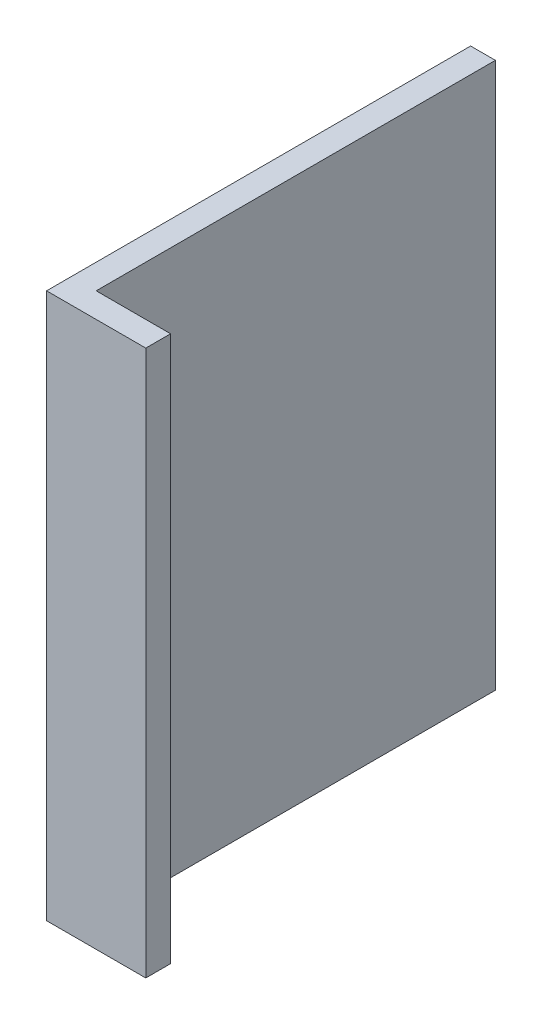
ISO-10303-21;
HEADER;
FILE_DESCRIPTION(('STEP AP214'),'2;1');
FILE_NAME('part.step','',(''),(''),'','','');
FILE_SCHEMA(('AUTOMOTIVE_DESIGN { 1 0 10303 214 1 1 1 1 }'));
ENDSEC;
DATA;
#1=APPLICATION_CONTEXT('core data for automotive mechanical design processes');
#2=APPLICATION_PROTOCOL_DEFINITION('international standard','automotive_design',2000,#1);
#3=PRODUCT_CONTEXT('',#1,'mechanical');
#4=PRODUCT('Part','Part','',(#3));
#5=PRODUCT_RELATED_PRODUCT_CATEGORY('part','',(#4));
#6=PRODUCT_DEFINITION_FORMATION('','',#4);
#7=PRODUCT_DEFINITION_CONTEXT('part definition',#1,'design');
#8=PRODUCT_DEFINITION('design','',#6,#7);
#9=PRODUCT_DEFINITION_SHAPE('','',#8);
#10=(LENGTH_UNIT() NAMED_UNIT(*) SI_UNIT(.MILLI.,.METRE.));
#11=(NAMED_UNIT(*) PLANE_ANGLE_UNIT() SI_UNIT($,.RADIAN.));
#12=(NAMED_UNIT(*) SI_UNIT($,.STERADIAN.) SOLID_ANGLE_UNIT());
#13=UNCERTAINTY_MEASURE_WITH_UNIT(LENGTH_MEASURE(1.E-05),#10,'distance_accuracy_value','');
#14=(GEOMETRIC_REPRESENTATION_CONTEXT(3) GLOBAL_UNCERTAINTY_ASSIGNED_CONTEXT((#13)) GLOBAL_UNIT_ASSIGNED_CONTEXT((#10,
#11,#12)) REPRESENTATION_CONTEXT('',''));
#15=CARTESIAN_POINT('',(0.,0.,0.));
#16=DIRECTION('',(0.,0.,1.));
#17=DIRECTION('',(1.,0.,0.));
#18=AXIS2_PLACEMENT_3D('',#15,#16,#17);
#19=CARTESIAN_POINT('',(-7.56033929171414,11.,-0.5));
#20=DIRECTION('',(-1.,0.,0.));
#21=DIRECTION('',(0.,0.,1.));
#22=AXIS2_PLACEMENT_3D('',#19,#20,#21);
#23=PLANE('',#22);
#24=DIRECTION('',(0.,0.,-1.));
#25=VECTOR('',#24,1.);
#26=CARTESIAN_POINT('',(-7.56033929171414,0.,-0.5));
#27=LINE('',#26,#25);
#28=CARTESIAN_POINT('',(-7.56033929171414,0.,0.));
#29=VERTEX_POINT('',#28);
#30=CARTESIAN_POINT('',(-7.56033929171414,0.,-0.5));
#31=VERTEX_POINT('',#30);
#32=EDGE_CURVE('E128',#29,#31,#27,.T.);
#33=ORIENTED_EDGE('',*,*,#32,.T.);
#34=DIRECTION('',(0.,-1.,0.));
#35=VECTOR('',#34,1.);
#36=CARTESIAN_POINT('',(-7.56033929171414,11.,-0.5));
#37=LINE('',#36,#35);
#38=CARTESIAN_POINT('',(-7.56033929171414,11.,-0.5));
#39=VERTEX_POINT('',#38);
#40=EDGE_CURVE('E11',#39,#31,#37,.T.);
#41=ORIENTED_EDGE('',*,*,#40,.F.);
#42=DIRECTION('',(0.,0.,-1.));
#43=VECTOR('',#42,1.);
#44=CARTESIAN_POINT('',(-7.56033929171414,11.,-0.5));
#45=LINE('',#44,#43);
#46=CARTESIAN_POINT('',(-7.56033929171414,11.,0.));
#47=VERTEX_POINT('',#46);
#48=EDGE_CURVE('E144',#47,#39,#45,.T.);
#49=ORIENTED_EDGE('',*,*,#48,.F.);
#50=DIRECTION('',(0.,-1.,0.));
#51=VECTOR('',#50,1.);
#52=CARTESIAN_POINT('',(-7.56033929171414,11.,0.));
#53=LINE('',#52,#51);
#54=EDGE_CURVE('E124',#47,#29,#53,.T.);
#55=ORIENTED_EDGE('',*,*,#54,.T.);
#56=EDGE_LOOP('',(#33,#41,#49,#55));
#57=FACE_BOUND('',#56,.T.);
#58=ADVANCED_FACE('F39',(#57),#23,.F.);
#59=CARTESIAN_POINT('',(-9.06033929171414,11.,-0.5));
#60=DIRECTION('',(0.,0.,1.));
#61=DIRECTION('',(1.,0.,0.));
#62=AXIS2_PLACEMENT_3D('',#59,#60,#61);
#63=PLANE('',#62);
#64=DIRECTION('',(-1.,0.,0.));
#65=VECTOR('',#64,1.);
#66=CARTESIAN_POINT('',(-9.06033929171414,0.,-0.5));
#67=LINE('',#66,#65);
#68=CARTESIAN_POINT('',(-9.06033929171414,0.,-0.5));
#69=VERTEX_POINT('',#68);
#70=EDGE_CURVE('E132',#31,#69,#67,.T.);
#71=ORIENTED_EDGE('',*,*,#70,.T.);
#72=DIRECTION('',(0.,-1.,0.));
#73=VECTOR('',#72,1.);
#74=CARTESIAN_POINT('',(-9.06033929171414,11.,-0.5));
#75=LINE('',#74,#73);
#76=CARTESIAN_POINT('',(-9.06033929171414,11.,-0.5));
#77=VERTEX_POINT('',#76);
#78=EDGE_CURVE('E48',#77,#69,#75,.T.);
#79=ORIENTED_EDGE('',*,*,#78,.F.);
#80=DIRECTION('',(-1.,0.,0.));
#81=VECTOR('',#80,1.);
#82=CARTESIAN_POINT('',(-9.06033929171414,11.,-0.5));
#83=LINE('',#82,#81);
#84=EDGE_CURVE('E93',#39,#77,#83,.T.);
#85=ORIENTED_EDGE('',*,*,#84,.F.);
#86=ORIENTED_EDGE('',*,*,#40,.T.);
#87=EDGE_LOOP('',(#71,#79,#85,#86));
#88=FACE_BOUND('',#87,.T.);
#89=ADVANCED_FACE('F172',(#88),#63,.F.);
#90=CARTESIAN_POINT('',(-9.06033929171414,11.,-8.55));
#91=DIRECTION('',(-1.,0.,0.));
#92=DIRECTION('',(0.,0.,1.));
#93=AXIS2_PLACEMENT_3D('',#90,#91,#92);
#94=PLANE('',#93);
#95=DIRECTION('',(0.,0.,-1.));
#96=VECTOR('',#95,1.);
#97=CARTESIAN_POINT('',(-9.06033929171414,0.,-8.55));
#98=LINE('',#97,#96);
#99=CARTESIAN_POINT('',(-9.06033929171414,0.,-8.55));
#100=VERTEX_POINT('',#99);
#101=EDGE_CURVE('E135',#69,#100,#98,.T.);
#102=ORIENTED_EDGE('',*,*,#101,.T.);
#103=DIRECTION('',(0.,-1.,0.));
#104=VECTOR('',#103,1.);
#105=CARTESIAN_POINT('',(-9.06033929171414,11.,-8.55));
#106=LINE('',#105,#104);
#107=CARTESIAN_POINT('',(-9.06033929171414,11.,-8.55));
#108=VERTEX_POINT('',#107);
#109=EDGE_CURVE('E117',#108,#100,#106,.T.);
#110=ORIENTED_EDGE('',*,*,#109,.F.);
#111=DIRECTION('',(0.,0.,-1.));
#112=VECTOR('',#111,1.);
#113=CARTESIAN_POINT('',(-9.06033929171414,11.,-8.55));
#114=LINE('',#113,#112);
#115=EDGE_CURVE('E106',#77,#108,#114,.T.);
#116=ORIENTED_EDGE('',*,*,#115,.F.);
#117=ORIENTED_EDGE('',*,*,#78,.T.);
#118=EDGE_LOOP('',(#102,#110,#116,#117));
#119=FACE_BOUND('',#118,.T.);
#120=ADVANCED_FACE('F154',(#119),#94,.F.);
#121=CARTESIAN_POINT('',(-9.56033929171414,11.,-8.55));
#122=DIRECTION('',(0.,0.,1.));
#123=DIRECTION('',(1.,0.,0.));
#124=AXIS2_PLACEMENT_3D('',#121,#122,#123);
#125=PLANE('',#124);
#126=DIRECTION('',(-1.,0.,0.));
#127=VECTOR('',#126,1.);
#128=CARTESIAN_POINT('',(-9.56033929171414,0.,-8.55));
#129=LINE('',#128,#127);
#130=CARTESIAN_POINT('',(-9.56033929171414,0.,-8.55));
#131=VERTEX_POINT('',#130);
#132=EDGE_CURVE('E115',#100,#131,#129,.T.);
#133=ORIENTED_EDGE('',*,*,#132,.T.);
#134=DIRECTION('',(0.,-1.,0.));
#135=VECTOR('',#134,1.);
#136=CARTESIAN_POINT('',(-9.56033929171414,11.,-8.55));
#137=LINE('',#136,#135);
#138=CARTESIAN_POINT('',(-9.56033929171414,11.,-8.55));
#139=VERTEX_POINT('',#138);
#140=EDGE_CURVE('E112',#139,#131,#137,.T.);
#141=ORIENTED_EDGE('',*,*,#140,.F.);
#142=DIRECTION('',(-1.,0.,0.));
#143=VECTOR('',#142,1.);
#144=CARTESIAN_POINT('',(-9.56033929171414,11.,-8.55));
#145=LINE('',#144,#143);
#146=EDGE_CURVE('E100',#108,#139,#145,.T.);
#147=ORIENTED_EDGE('',*,*,#146,.F.);
#148=ORIENTED_EDGE('',*,*,#109,.T.);
#149=EDGE_LOOP('',(#133,#141,#147,#148));
#150=FACE_BOUND('',#149,.T.);
#151=ADVANCED_FACE('F113',(#150),#125,.F.);
#152=CARTESIAN_POINT('',(-9.56033929171414,11.,0.));
#153=DIRECTION('',(1.,0.,0.));
#154=DIRECTION('',(0.,0.,-1.));
#155=AXIS2_PLACEMENT_3D('',#152,#153,#154);
#156=PLANE('',#155);
#157=DIRECTION('',(0.,0.,1.));
#158=VECTOR('',#157,1.);
#159=CARTESIAN_POINT('',(-9.56033929171414,0.,0.));
#160=LINE('',#159,#158);
#161=CARTESIAN_POINT('',(-9.56033929171414,0.,0.));
#162=VERTEX_POINT('',#161);
#163=EDGE_CURVE('E79',#131,#162,#160,.T.);
#164=ORIENTED_EDGE('',*,*,#163,.T.);
#165=DIRECTION('',(0.,-1.,0.));
#166=VECTOR('',#165,1.);
#167=CARTESIAN_POINT('',(-9.56033929171414,11.,0.));
#168=LINE('',#167,#166);
#169=CARTESIAN_POINT('',(-9.56033929171414,11.,0.));
#170=VERTEX_POINT('',#169);
#171=EDGE_CURVE('E118',#170,#162,#168,.T.);
#172=ORIENTED_EDGE('',*,*,#171,.F.);
#173=DIRECTION('',(0.,0.,1.));
#174=VECTOR('',#173,1.);
#175=CARTESIAN_POINT('',(-9.56033929171414,11.,0.));
#176=LINE('',#175,#174);
#177=EDGE_CURVE('E104',#139,#170,#176,.T.);
#178=ORIENTED_EDGE('',*,*,#177,.F.);
#179=ORIENTED_EDGE('',*,*,#140,.T.);
#180=EDGE_LOOP('',(#164,#172,#178,#179));
#181=FACE_BOUND('',#180,.T.);
#182=ADVANCED_FACE('F120',(#181),#156,.F.);
#183=CARTESIAN_POINT('',(-7.56033929171414,11.,0.));
#184=DIRECTION('',(0.,0.,-1.));
#185=DIRECTION('',(-1.,0.,0.));
#186=AXIS2_PLACEMENT_3D('',#183,#184,#185);
#187=PLANE('',#186);
#188=DIRECTION('',(1.,0.,0.));
#189=VECTOR('',#188,1.);
#190=CARTESIAN_POINT('',(-7.56033929171414,0.,0.));
#191=LINE('',#190,#189);
#192=EDGE_CURVE('E85',#162,#29,#191,.T.);
#193=ORIENTED_EDGE('',*,*,#192,.T.);
#194=ORIENTED_EDGE('',*,*,#54,.F.);
#195=DIRECTION('',(1.,0.,0.));
#196=VECTOR('',#195,1.);
#197=CARTESIAN_POINT('',(-7.56033929171414,11.,0.));
#198=LINE('',#197,#196);
#199=EDGE_CURVE('E56',#170,#47,#198,.T.);
#200=ORIENTED_EDGE('',*,*,#199,.F.);
#201=ORIENTED_EDGE('',*,*,#171,.T.);
#202=EDGE_LOOP('',(#193,#194,#200,#201));
#203=FACE_BOUND('',#202,.T.);
#204=ADVANCED_FACE('F161',(#203),#187,.F.);
#205=CARTESIAN_POINT('',(0.,11.,0.));
#206=DIRECTION('',(0.,-1.,0.));
#207=DIRECTION('',(0.,0.,-1.));
#208=AXIS2_PLACEMENT_3D('',#205,#206,#207);
#209=PLANE('',#208);
#210=ORIENTED_EDGE('',*,*,#48,.T.);
#211=ORIENTED_EDGE('',*,*,#84,.T.);
#212=ORIENTED_EDGE('',*,*,#115,.T.);
#213=ORIENTED_EDGE('',*,*,#146,.T.);
#214=ORIENTED_EDGE('',*,*,#177,.T.);
#215=ORIENTED_EDGE('',*,*,#199,.T.);
#216=EDGE_LOOP('',(#210,#211,#212,#213,#214,#215));
#217=FACE_BOUND('',#216,.T.);
#218=ADVANCED_FACE('F102',(#217),#209,.F.);
#219=CARTESIAN_POINT('',(0.,0.,0.));
#220=DIRECTION('',(0.,-1.,0.));
#221=DIRECTION('',(0.,0.,-1.));
#222=AXIS2_PLACEMENT_3D('',#219,#220,#221);
#223=PLANE('',#222);
#224=ORIENTED_EDGE('',*,*,#32,.F.);
#225=ORIENTED_EDGE('',*,*,#192,.F.);
#226=ORIENTED_EDGE('',*,*,#163,.F.);
#227=ORIENTED_EDGE('',*,*,#132,.F.);
#228=ORIENTED_EDGE('',*,*,#101,.F.);
#229=ORIENTED_EDGE('',*,*,#70,.F.);
#230=EDGE_LOOP('',(#224,#225,#226,#227,#228,#229));
#231=FACE_BOUND('',#230,.T.);
#232=ADVANCED_FACE('F157',(#231),#223,.T.);
#233=CLOSED_SHELL('',(#58,#89,#120,#151,#182,#204,#218,#232));
#234=MANIFOLD_SOLID_BREP('B2',#233);
#235=ADVANCED_BREP_SHAPE_REPRESENTATION('',(#18,#234),#14);
#236=SHAPE_DEFINITION_REPRESENTATION(#9,#235);
ENDSEC;
END-ISO-10303-21;
